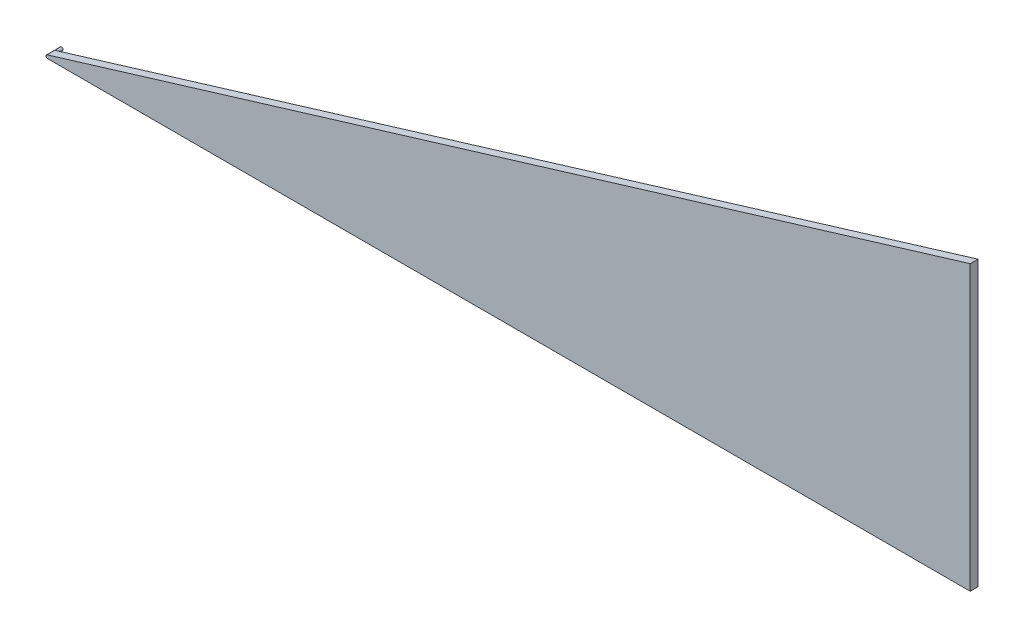
ISO-10303-21;
HEADER;
FILE_DESCRIPTION(('STEP AP214'),'2;1');
FILE_NAME('part.step','',(''),(''),'','','');
FILE_SCHEMA(('AUTOMOTIVE_DESIGN { 1 0 10303 214 1 1 1 1 }'));
ENDSEC;
DATA;
#1=APPLICATION_CONTEXT('core data for automotive mechanical design processes');
#2=APPLICATION_PROTOCOL_DEFINITION('international standard','automotive_design',2000,#1);
#3=PRODUCT_CONTEXT('',#1,'mechanical');
#4=PRODUCT('Part','Part','',(#3));
#5=PRODUCT_RELATED_PRODUCT_CATEGORY('part','',(#4));
#6=PRODUCT_DEFINITION_FORMATION('','',#4);
#7=PRODUCT_DEFINITION_CONTEXT('part definition',#1,'design');
#8=PRODUCT_DEFINITION('design','',#6,#7);
#9=PRODUCT_DEFINITION_SHAPE('','',#8);
#10=(LENGTH_UNIT() NAMED_UNIT(*) SI_UNIT(.MILLI.,.METRE.));
#11=(NAMED_UNIT(*) PLANE_ANGLE_UNIT() SI_UNIT($,.RADIAN.));
#12=(NAMED_UNIT(*) SI_UNIT($,.STERADIAN.) SOLID_ANGLE_UNIT());
#13=UNCERTAINTY_MEASURE_WITH_UNIT(LENGTH_MEASURE(1.E-05),#10,'distance_accuracy_value','');
#14=(GEOMETRIC_REPRESENTATION_CONTEXT(3) GLOBAL_UNCERTAINTY_ASSIGNED_CONTEXT((#13)) GLOBAL_UNIT_ASSIGNED_CONTEXT((#10,
#11,#12)) REPRESENTATION_CONTEXT('',''));
#15=CARTESIAN_POINT('',(0.,0.,0.));
#16=DIRECTION('',(0.,0.,1.));
#17=DIRECTION('',(1.,0.,0.));
#18=AXIS2_PLACEMENT_3D('',#15,#16,#17);
#19=CARTESIAN_POINT('',(0.,0.,80.));
#20=DIRECTION('',(0.,0.,-1.));
#21=DIRECTION('',(-1.,0.,0.));
#22=AXIS2_PLACEMENT_3D('',#19,#20,#21);
#23=CYLINDRICAL_SURFACE('',#22,20.);
#24=CARTESIAN_POINT('',(0.,0.,80.));
#25=DIRECTION('',(0.,0.,1.));
#26=DIRECTION('',(1.,0.,0.));
#27=AXIS2_PLACEMENT_3D('',#24,#25,#26);
#28=CIRCLE('',#27,20.);
#29=CARTESIAN_POINT('',(0.,-20.,80.));
#30=VERTEX_POINT('',#29);
#31=CARTESIAN_POINT('',(-5.81829502279872,19.1349795669521,80.));
#32=VERTEX_POINT('',#31);
#33=EDGE_CURVE('E11',#30,#32,#28,.T.);
#34=ORIENTED_EDGE('',*,*,#33,.F.);
#35=DIRECTION('',(0.,0.,-1.));
#36=VECTOR('',#35,1.);
#37=CARTESIAN_POINT('',(0.,-20.,180.));
#38=LINE('',#37,#36);
#39=CARTESIAN_POINT('',(0.,-20.,180.));
#40=VERTEX_POINT('',#39);
#41=EDGE_CURVE('E99',#40,#30,#38,.T.);
#42=ORIENTED_EDGE('',*,*,#41,.F.);
#43=CARTESIAN_POINT('',(0.,0.,180.));
#44=DIRECTION('',(0.,0.,1.));
#45=DIRECTION('',(1.,0.,0.));
#46=AXIS2_PLACEMENT_3D('',#43,#44,#45);
#47=CIRCLE('',#46,20.);
#48=CARTESIAN_POINT('',(-5.81829502279872,19.1349795669521,180.));
#49=VERTEX_POINT('',#48);
#50=EDGE_CURVE('E89',#49,#40,#47,.T.);
#51=ORIENTED_EDGE('',*,*,#50,.F.);
#52=DIRECTION('',(0.,0.,-1.));
#53=VECTOR('',#52,1.);
#54=CARTESIAN_POINT('',(-5.81829502279872,19.1349795669521,180.));
#55=LINE('',#54,#53);
#56=EDGE_CURVE('E107',#49,#32,#55,.T.);
#57=ORIENTED_EDGE('',*,*,#56,.T.);
#58=EDGE_LOOP('',(#34,#42,#51,#57));
#59=FACE_BOUND('',#58,.T.);
#60=CARTESIAN_POINT('',(0.,0.,0.));
#61=DIRECTION('',(0.,0.,1.));
#62=DIRECTION('',(1.,0.,0.));
#63=AXIS2_PLACEMENT_3D('',#60,#61,#62);
#64=CIRCLE('',#63,20.);
#65=CARTESIAN_POINT('',(20.,0.,0.));
#66=VERTEX_POINT('',#65);
#67=EDGE_CURVE('E42',#66,#66,#64,.T.);
#68=ORIENTED_EDGE('',*,*,#67,.T.);
#69=EDGE_LOOP('',(#68));
#70=FACE_BOUND('',#69,.T.);
#71=ADVANCED_FACE('F39',(#59,#70),#23,.T.);
#72=CARTESIAN_POINT('',(0.,0.,0.));
#73=DIRECTION('',(0.,0.,1.));
#74=DIRECTION('',(1.,0.,0.));
#75=AXIS2_PLACEMENT_3D('',#72,#73,#74);
#76=PLANE('',#75);
#77=ORIENTED_EDGE('',*,*,#67,.F.);
#78=EDGE_LOOP('',(#77));
#79=FACE_BOUND('',#78,.T.);
#80=ADVANCED_FACE('F129',(#79),#76,.F.);
#81=CARTESIAN_POINT('',(0.,0.,80.));
#82=DIRECTION('',(0.,0.,1.));
#83=DIRECTION('',(1.,0.,0.));
#84=AXIS2_PLACEMENT_3D('',#81,#82,#83);
#85=PLANE('',#84);
#86=DIRECTION('',(1.,0.,0.));
#87=VECTOR('',#86,1.);
#88=CARTESIAN_POINT('',(0.,-20.,80.));
#89=LINE('',#88,#87);
#90=CARTESIAN_POINT('',(11858.2989729382,-19.9999999999999,80.));
#91=VERTEX_POINT('',#90);
#92=EDGE_CURVE('E95',#30,#91,#89,.T.);
#93=ORIENTED_EDGE('',*,*,#92,.F.);
#94=ORIENTED_EDGE('',*,*,#33,.T.);
#95=DIRECTION('',(-0.956748978347606,-0.290914751139937,0.));
#96=VECTOR('',#95,1.);
#97=CARTESIAN_POINT('',(-5.81829502279872,19.1349795669521,80.));
#98=LINE('',#97,#96);
#99=CARTESIAN_POINT('',(11858.2989729382,3626.60862272136,80.));
#100=VERTEX_POINT('',#99);
#101=EDGE_CURVE('E116',#100,#32,#98,.T.);
#102=ORIENTED_EDGE('',*,*,#101,.F.);
#103=DIRECTION('',(0.,1.,0.));
#104=VECTOR('',#103,1.);
#105=CARTESIAN_POINT('',(11858.2989729382,3626.60862272136,80.));
#106=LINE('',#105,#104);
#107=EDGE_CURVE('E113',#91,#100,#106,.T.);
#108=ORIENTED_EDGE('',*,*,#107,.F.);
#109=EDGE_LOOP('',(#93,#94,#102,#108));
#110=FACE_BOUND('',#109,.T.);
#111=ADVANCED_FACE('F131',(#110),#85,.F.);
#112=CARTESIAN_POINT('',(0.,-20.,180.));
#113=DIRECTION('',(0.,1.,0.));
#114=DIRECTION('',(-1.,0.,0.));
#115=AXIS2_PLACEMENT_3D('',#112,#113,#114);
#116=PLANE('',#115);
#117=ORIENTED_EDGE('',*,*,#92,.T.);
#118=DIRECTION('',(0.,0.,-1.));
#119=VECTOR('',#118,1.);
#120=CARTESIAN_POINT('',(11858.2989729382,-19.9999999999999,180.));
#121=LINE('',#120,#119);
#122=CARTESIAN_POINT('',(11858.2989729382,-19.9999999999999,180.));
#123=VERTEX_POINT('',#122);
#124=EDGE_CURVE('E93',#123,#91,#121,.T.);
#125=ORIENTED_EDGE('',*,*,#124,.F.);
#126=DIRECTION('',(1.,0.,0.));
#127=VECTOR('',#126,1.);
#128=CARTESIAN_POINT('',(0.,-20.,180.));
#129=LINE('',#128,#127);
#130=EDGE_CURVE('E83',#40,#123,#129,.T.);
#131=ORIENTED_EDGE('',*,*,#130,.F.);
#132=ORIENTED_EDGE('',*,*,#41,.T.);
#133=EDGE_LOOP('',(#117,#125,#131,#132));
#134=FACE_BOUND('',#133,.T.);
#135=ADVANCED_FACE('F94',(#134),#116,.F.);
#136=CARTESIAN_POINT('',(11858.2989729382,3626.60862272136,180.));
#137=DIRECTION('',(-1.,0.,0.));
#138=DIRECTION('',(0.,0.,1.));
#139=AXIS2_PLACEMENT_3D('',#136,#137,#138);
#140=PLANE('',#139);
#141=ORIENTED_EDGE('',*,*,#107,.T.);
#142=DIRECTION('',(0.,0.,-1.));
#143=VECTOR('',#142,1.);
#144=CARTESIAN_POINT('',(11858.2989729382,3626.60862272136,180.));
#145=LINE('',#144,#143);
#146=CARTESIAN_POINT('',(11858.2989729382,3626.60862272136,180.));
#147=VERTEX_POINT('',#146);
#148=EDGE_CURVE('E100',#147,#100,#145,.T.);
#149=ORIENTED_EDGE('',*,*,#148,.F.);
#150=DIRECTION('',(0.,1.,0.));
#151=VECTOR('',#150,1.);
#152=CARTESIAN_POINT('',(11858.2989729382,3626.60862272136,180.));
#153=LINE('',#152,#151);
#154=EDGE_CURVE('E86',#123,#147,#153,.T.);
#155=ORIENTED_EDGE('',*,*,#154,.F.);
#156=ORIENTED_EDGE('',*,*,#124,.T.);
#157=EDGE_LOOP('',(#141,#149,#155,#156));
#158=FACE_BOUND('',#157,.T.);
#159=ADVANCED_FACE('F102',(#158),#140,.F.);
#160=CARTESIAN_POINT('',(-5.81829502279872,19.1349795669521,180.));
#161=DIRECTION('',(0.290914751139937,-0.956748978347606,0.));
#162=DIRECTION('',(0.956748978347606,0.290914751139937,0.));
#163=AXIS2_PLACEMENT_3D('',#160,#161,#162);
#164=PLANE('',#163);
#165=ORIENTED_EDGE('',*,*,#101,.T.);
#166=ORIENTED_EDGE('',*,*,#56,.F.);
#167=DIRECTION('',(-0.956748978347606,-0.290914751139937,0.));
#168=VECTOR('',#167,1.);
#169=CARTESIAN_POINT('',(-5.81829502279872,19.1349795669521,180.));
#170=LINE('',#169,#168);
#171=EDGE_CURVE('E61',#147,#49,#170,.T.);
#172=ORIENTED_EDGE('',*,*,#171,.F.);
#173=ORIENTED_EDGE('',*,*,#148,.T.);
#174=EDGE_LOOP('',(#165,#166,#172,#173));
#175=FACE_BOUND('',#174,.T.);
#176=ADVANCED_FACE('F142',(#175),#164,.F.);
#177=CARTESIAN_POINT('',(0.,0.,180.));
#178=DIRECTION('',(0.,0.,1.));
#179=DIRECTION('',(1.,0.,0.));
#180=AXIS2_PLACEMENT_3D('',#177,#178,#179);
#181=PLANE('',#180);
#182=ORIENTED_EDGE('',*,*,#50,.T.);
#183=ORIENTED_EDGE('',*,*,#130,.T.);
#184=ORIENTED_EDGE('',*,*,#154,.T.);
#185=ORIENTED_EDGE('',*,*,#171,.T.);
#186=EDGE_LOOP('',(#182,#183,#184,#185));
#187=FACE_BOUND('',#186,.T.);
#188=ADVANCED_FACE('F84',(#187),#181,.T.);
#189=CLOSED_SHELL('',(#71,#80,#111,#135,#159,#176,#188));
#190=MANIFOLD_SOLID_BREP('B2',#189);
#191=ADVANCED_BREP_SHAPE_REPRESENTATION('',(#18,#190),#14);
#192=SHAPE_DEFINITION_REPRESENTATION(#9,#191);
ENDSEC;
END-ISO-10303-21;
